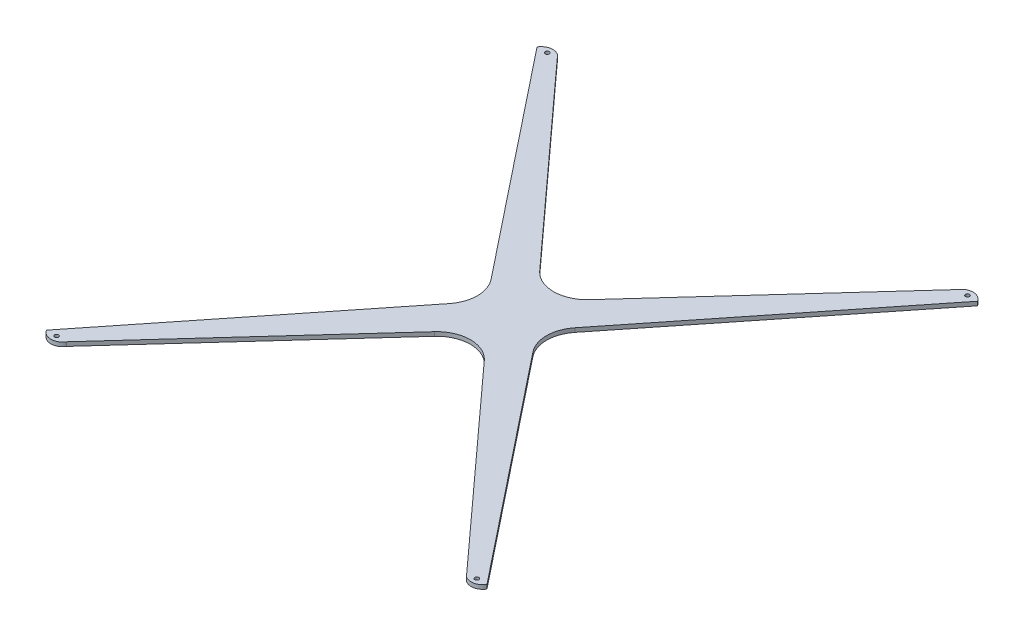
ISO-10303-21;
HEADER;
FILE_DESCRIPTION(('STEP AP214'),'2;1');
FILE_NAME('part.step','',(''),(''),'','','');
FILE_SCHEMA(('AUTOMOTIVE_DESIGN { 1 0 10303 214 1 1 1 1 }'));
ENDSEC;
DATA;
#1=APPLICATION_CONTEXT('core data for automotive mechanical design processes');
#2=APPLICATION_PROTOCOL_DEFINITION('international standard','automotive_design',2000,#1);
#3=PRODUCT_CONTEXT('',#1,'mechanical');
#4=PRODUCT('Part','Part','',(#3));
#5=PRODUCT_RELATED_PRODUCT_CATEGORY('part','',(#4));
#6=PRODUCT_DEFINITION_FORMATION('','',#4);
#7=PRODUCT_DEFINITION_CONTEXT('part definition',#1,'design');
#8=PRODUCT_DEFINITION('design','',#6,#7);
#9=PRODUCT_DEFINITION_SHAPE('','',#8);
#10=(LENGTH_UNIT() NAMED_UNIT(*) SI_UNIT(.MILLI.,.METRE.));
#11=(NAMED_UNIT(*) PLANE_ANGLE_UNIT() SI_UNIT($,.RADIAN.));
#12=(NAMED_UNIT(*) SI_UNIT($,.STERADIAN.) SOLID_ANGLE_UNIT());
#13=UNCERTAINTY_MEASURE_WITH_UNIT(LENGTH_MEASURE(1.E-05),#10,'distance_accuracy_value','');
#14=(GEOMETRIC_REPRESENTATION_CONTEXT(3) GLOBAL_UNCERTAINTY_ASSIGNED_CONTEXT((#13)) GLOBAL_UNIT_ASSIGNED_CONTEXT((#10,
#11,#12)) REPRESENTATION_CONTEXT('',''));
#15=CARTESIAN_POINT('',(0.,0.,0.));
#16=DIRECTION('',(0.,0.,1.));
#17=DIRECTION('',(1.,0.,0.));
#18=AXIS2_PLACEMENT_3D('',#15,#16,#17);
#19=CARTESIAN_POINT('',(0.,12.,-1441.02941176471));
#20=DIRECTION('',(0.,-1.,0.));
#21=DIRECTION('',(0.,0.,-1.));
#22=AXIS2_PLACEMENT_3D('',#19,#20,#21);
#23=PLANE('',#22);
#24=CARTESIAN_POINT('',(0.,12.,-1441.02941176471));
#25=DIRECTION('',(0.,1.,0.));
#26=DIRECTION('',(0.,0.,-1.));
#27=AXIS2_PLACEMENT_3D('',#24,#25,#26);
#28=CIRCLE('',#27,34.9705882352942);
#29=CARTESIAN_POINT('',(30.,12.,-1459.));
#30=VERTEX_POINT('',#29);
#31=CARTESIAN_POINT('',(-30.,12.,-1459.));
#32=VERTEX_POINT('',#31);
#33=EDGE_CURVE('E157',#30,#32,#28,.T.);
#34=ORIENTED_EDGE('',*,*,#33,.T.);
#35=DIRECTION('',(0.622336851804277,0.,0.78274954032969));
#36=VECTOR('',#35,1.);
#37=CARTESIAN_POINT('',(550.,12.,-729.5));
#38=LINE('',#37,#36);
#39=CARTESIAN_POINT('',(500.520168053944,12.,-791.733685180428));
#40=VERTEX_POINT('',#39);
#41=EDGE_CURVE('E145',#32,#40,#38,.T.);
#42=ORIENTED_EDGE('',*,*,#41,.T.);
#43=CARTESIAN_POINT('',(422.245214020975,12.,-729.5));
#44=DIRECTION('',(0.,-1.,0.));
#45=DIRECTION('',(0.,0.,-1.));
#46=AXIS2_PLACEMENT_3D('',#43,#44,#45);
#47=CIRCLE('',#46,100.);
#48=CARTESIAN_POINT('',(500.520168053944,12.,-667.266314819572));
#49=VERTEX_POINT('',#48);
#50=EDGE_CURVE('E198',#40,#49,#47,.T.);
#51=ORIENTED_EDGE('',*,*,#50,.T.);
#52=DIRECTION('',(-0.622336851804277,0.,0.78274954032969));
#53=VECTOR('',#52,1.);
#54=CARTESIAN_POINT('',(550.,12.,-729.5));
#55=LINE('',#54,#53);
#56=CARTESIAN_POINT('',(-30.,12.,0.));
#57=VERTEX_POINT('',#56);
#58=EDGE_CURVE('E156',#49,#57,#55,.T.);
#59=ORIENTED_EDGE('',*,*,#58,.T.);
#60=CARTESIAN_POINT('',(0.,12.,-17.9705882352943));
#61=DIRECTION('',(0.,1.,0.));
#62=DIRECTION('',(0.,0.,1.));
#63=AXIS2_PLACEMENT_3D('',#60,#61,#62);
#64=CIRCLE('',#63,34.9705882352942);
#65=CARTESIAN_POINT('',(30.,12.,0.));
#66=VERTEX_POINT('',#65);
#67=EDGE_CURVE('E291',#57,#66,#64,.T.);
#68=ORIENTED_EDGE('',*,*,#67,.T.);
#69=DIRECTION('',(0.672672793996312,0.,-0.739940073395944));
#70=VECTOR('',#69,1.);
#71=CARTESIAN_POINT('',(30.,12.,0.));
#72=LINE('',#71,#70);
#73=CARTESIAN_POINT('',(551.005992660406,12.,-573.106591926446));
#74=VERTEX_POINT('',#73);
#75=EDGE_CURVE('E265',#66,#74,#72,.T.);
#76=ORIENTED_EDGE('',*,*,#75,.T.);
#77=CARTESIAN_POINT('',(625.,12.,-505.839312526815));
#78=DIRECTION('',(0.,-1.,0.));
#79=DIRECTION('',(0.,0.,-1.));
#80=AXIS2_PLACEMENT_3D('',#77,#78,#79);
#81=CIRCLE('',#80,100.);
#82=CARTESIAN_POINT('',(698.994007339594,12.,-573.106591926446));
#83=VERTEX_POINT('',#82);
#84=EDGE_CURVE('E11',#74,#83,#81,.T.);
#85=ORIENTED_EDGE('',*,*,#84,.T.);
#86=DIRECTION('',(0.672672793996312,0.,0.739940073395944));
#87=VECTOR('',#86,1.);
#88=CARTESIAN_POINT('',(625.,12.,-654.5));
#89=LINE('',#88,#87);
#90=CARTESIAN_POINT('',(1220.,12.,0.));
#91=VERTEX_POINT('',#90);
#92=EDGE_CURVE('E288',#83,#91,#89,.T.);
#93=ORIENTED_EDGE('',*,*,#92,.T.);
#94=CARTESIAN_POINT('',(1250.,12.,-17.9705882352938));
#95=DIRECTION('',(0.,1.,0.));
#96=DIRECTION('',(0.,0.,-1.));
#97=AXIS2_PLACEMENT_3D('',#94,#95,#96);
#98=CIRCLE('',#97,34.970588235294);
#99=CARTESIAN_POINT('',(1280.,12.,-4.57966997657877E-13));
#100=VERTEX_POINT('',#99);
#101=EDGE_CURVE('E286',#91,#100,#98,.T.);
#102=ORIENTED_EDGE('',*,*,#101,.T.);
#103=DIRECTION('',(-0.622336851804277,0.,-0.78274954032969));
#104=VECTOR('',#103,1.);
#105=CARTESIAN_POINT('',(1280.,12.,0.));
#106=LINE('',#105,#104);
#107=CARTESIAN_POINT('',(749.479831946056,12.,-667.266314819573));
#108=VERTEX_POINT('',#107);
#109=EDGE_CURVE('E213',#100,#108,#106,.T.);
#110=ORIENTED_EDGE('',*,*,#109,.T.);
#111=CARTESIAN_POINT('',(827.754785979025,12.,-729.5));
#112=DIRECTION('',(0.,-1.,0.));
#113=DIRECTION('',(0.,0.,-1.));
#114=AXIS2_PLACEMENT_3D('',#111,#112,#113);
#115=CIRCLE('',#114,100.);
#116=CARTESIAN_POINT('',(749.479831946056,12.,-791.733685180428));
#117=VERTEX_POINT('',#116);
#118=EDGE_CURVE('E206',#108,#117,#115,.T.);
#119=ORIENTED_EDGE('',*,*,#118,.T.);
#120=DIRECTION('',(0.622336851804277,0.,-0.78274954032969));
#121=VECTOR('',#120,1.);
#122=CARTESIAN_POINT('',(700.,12.,-729.5));
#123=LINE('',#122,#121);
#124=CARTESIAN_POINT('',(1280.,12.,-1459.));
#125=VERTEX_POINT('',#124);
#126=EDGE_CURVE('E210',#117,#125,#123,.T.);
#127=ORIENTED_EDGE('',*,*,#126,.T.);
#128=CARTESIAN_POINT('',(1250.,12.,-1441.02941176471));
#129=DIRECTION('',(0.,1.,0.));
#130=DIRECTION('',(0.,0.,1.));
#131=AXIS2_PLACEMENT_3D('',#128,#129,#130);
#132=CIRCLE('',#131,34.9705882352942);
#133=CARTESIAN_POINT('',(1220.,12.,-1459.));
#134=VERTEX_POINT('',#133);
#135=EDGE_CURVE('E223',#125,#134,#132,.T.);
#136=ORIENTED_EDGE('',*,*,#135,.T.);
#137=DIRECTION('',(-0.672672793996312,0.,0.739940073395944));
#138=VECTOR('',#137,1.);
#139=CARTESIAN_POINT('',(625.,12.,-804.5));
#140=LINE('',#139,#138);
#141=CARTESIAN_POINT('',(698.994007339594,12.,-885.893408073554));
#142=VERTEX_POINT('',#141);
#143=EDGE_CURVE('E281',#134,#142,#140,.T.);
#144=ORIENTED_EDGE('',*,*,#143,.T.);
#145=CARTESIAN_POINT('',(625.,12.,-953.160687473185));
#146=DIRECTION('',(0.,-1.,0.));
#147=DIRECTION('',(0.,0.,-1.));
#148=AXIS2_PLACEMENT_3D('',#145,#146,#147);
#149=CIRCLE('',#148,100.);
#150=CARTESIAN_POINT('',(551.005992660406,12.,-885.893408073554));
#151=VERTEX_POINT('',#150);
#152=EDGE_CURVE('E202',#142,#151,#149,.T.);
#153=ORIENTED_EDGE('',*,*,#152,.T.);
#154=DIRECTION('',(-0.672672793996312,0.,-0.739940073395944));
#155=VECTOR('',#154,1.);
#156=CARTESIAN_POINT('',(30.,12.,-1459.));
#157=LINE('',#156,#155);
#158=EDGE_CURVE('E162',#151,#30,#157,.T.);
#159=ORIENTED_EDGE('',*,*,#158,.T.);
#160=EDGE_LOOP('',(#34,#42,#51,#59,#68,#76,#85,#93,#102,#110,#119,#127,#136,#144,#153,#159));
#161=FACE_BOUND('',#160,.T.);
#162=CARTESIAN_POINT('',(1250.,12.,-1459.));
#163=DIRECTION('',(0.,1.,0.));
#164=DIRECTION('',(0.,0.,1.));
#165=AXIS2_PLACEMENT_3D('',#162,#163,#164);
#166=CIRCLE('',#165,6.0000000000001);
#167=CARTESIAN_POINT('',(1250.,12.,-1453.));
#168=VERTEX_POINT('',#167);
#169=EDGE_CURVE('E279',#168,#168,#166,.T.);
#170=ORIENTED_EDGE('',*,*,#169,.F.);
#171=EDGE_LOOP('',(#170));
#172=FACE_BOUND('',#171,.T.);
#173=CARTESIAN_POINT('',(0.,12.,-1459.));
#174=DIRECTION('',(0.,1.,0.));
#175=DIRECTION('',(0.,0.,1.));
#176=AXIS2_PLACEMENT_3D('',#173,#174,#175);
#177=CIRCLE('',#176,6.00000000000001);
#178=CARTESIAN_POINT('',(0.,12.,-1453.));
#179=VERTEX_POINT('',#178);
#180=EDGE_CURVE('E297',#179,#179,#177,.T.);
#181=ORIENTED_EDGE('',*,*,#180,.F.);
#182=EDGE_LOOP('',(#181));
#183=FACE_BOUND('',#182,.T.);
#184=CARTESIAN_POINT('',(1250.,12.,0.));
#185=DIRECTION('',(0.,1.,0.));
#186=DIRECTION('',(0.,0.,1.));
#187=AXIS2_PLACEMENT_3D('',#184,#185,#186);
#188=CIRCLE('',#187,6.0000000000001);
#189=CARTESIAN_POINT('',(1250.,12.,6.0000000000001));
#190=VERTEX_POINT('',#189);
#191=EDGE_CURVE('E303',#190,#190,#188,.T.);
#192=ORIENTED_EDGE('',*,*,#191,.F.);
#193=EDGE_LOOP('',(#192));
#194=FACE_BOUND('',#193,.T.);
#195=CARTESIAN_POINT('',(0.,12.,0.));
#196=DIRECTION('',(0.,1.,0.));
#197=DIRECTION('',(0.,0.,1.));
#198=AXIS2_PLACEMENT_3D('',#195,#196,#197);
#199=CIRCLE('',#198,6.);
#200=CARTESIAN_POINT('',(0.,12.,6.));
#201=VERTEX_POINT('',#200);
#202=EDGE_CURVE('E309',#201,#201,#199,.T.);
#203=ORIENTED_EDGE('',*,*,#202,.F.);
#204=EDGE_LOOP('',(#203));
#205=FACE_BOUND('',#204,.T.);
#206=ADVANCED_FACE('F32',(#161,#172,#183,#194,#205),#23,.F.);
#207=CARTESIAN_POINT('',(0.,0.,-1441.02941176471));
#208=DIRECTION('',(0.,-1.,0.));
#209=DIRECTION('',(0.,0.,-1.));
#210=AXIS2_PLACEMENT_3D('',#207,#208,#209);
#211=PLANE('',#210);
#212=CARTESIAN_POINT('',(1250.,0.,0.));
#213=DIRECTION('',(0.,1.,0.));
#214=DIRECTION('',(0.,0.,1.));
#215=AXIS2_PLACEMENT_3D('',#212,#213,#214);
#216=CIRCLE('',#215,6.0000000000001);
#217=CARTESIAN_POINT('',(1250.,0.,6.0000000000001));
#218=VERTEX_POINT('',#217);
#219=EDGE_CURVE('E306',#218,#218,#216,.T.);
#220=ORIENTED_EDGE('',*,*,#219,.T.);
#221=EDGE_LOOP('',(#220));
#222=FACE_BOUND('',#221,.T.);
#223=CARTESIAN_POINT('',(1250.,0.,-1459.));
#224=DIRECTION('',(0.,1.,0.));
#225=DIRECTION('',(0.,0.,1.));
#226=AXIS2_PLACEMENT_3D('',#223,#224,#225);
#227=CIRCLE('',#226,6.0000000000001);
#228=CARTESIAN_POINT('',(1250.,0.,-1453.));
#229=VERTEX_POINT('',#228);
#230=EDGE_CURVE('E294',#229,#229,#227,.T.);
#231=ORIENTED_EDGE('',*,*,#230,.T.);
#232=EDGE_LOOP('',(#231));
#233=FACE_BOUND('',#232,.T.);
#234=CARTESIAN_POINT('',(0.,0.,-1441.02941176471));
#235=DIRECTION('',(0.,1.,0.));
#236=DIRECTION('',(0.,0.,-1.));
#237=AXIS2_PLACEMENT_3D('',#234,#235,#236);
#238=CIRCLE('',#237,34.9705882352942);
#239=CARTESIAN_POINT('',(30.,0.,-1459.));
#240=VERTEX_POINT('',#239);
#241=CARTESIAN_POINT('',(-30.,0.,-1459.));
#242=VERTEX_POINT('',#241);
#243=EDGE_CURVE('E170',#240,#242,#238,.T.);
#244=ORIENTED_EDGE('',*,*,#243,.F.);
#245=DIRECTION('',(-0.672672793996312,0.,-0.739940073395944));
#246=VECTOR('',#245,1.);
#247=CARTESIAN_POINT('',(30.,0.,-1459.));
#248=LINE('',#247,#246);
#249=CARTESIAN_POINT('',(551.005992660406,0.,-885.893408073554));
#250=VERTEX_POINT('',#249);
#251=EDGE_CURVE('E166',#250,#240,#248,.T.);
#252=ORIENTED_EDGE('',*,*,#251,.F.);
#253=CARTESIAN_POINT('',(625.,0.,-953.160687473185));
#254=DIRECTION('',(0.,-1.,0.));
#255=DIRECTION('',(0.,0.,-1.));
#256=AXIS2_PLACEMENT_3D('',#253,#254,#255);
#257=CIRCLE('',#256,100.);
#258=CARTESIAN_POINT('',(698.994007339594,0.,-885.893408073554));
#259=VERTEX_POINT('',#258);
#260=EDGE_CURVE('E200',#250,#259,#257,.F.);
#261=ORIENTED_EDGE('',*,*,#260,.T.);
#262=DIRECTION('',(-0.672672793996312,0.,0.739940073395944));
#263=VECTOR('',#262,1.);
#264=CARTESIAN_POINT('',(625.,0.,-804.5));
#265=LINE('',#264,#263);
#266=CARTESIAN_POINT('',(1220.,0.,-1459.));
#267=VERTEX_POINT('',#266);
#268=EDGE_CURVE('E248',#267,#259,#265,.T.);
#269=ORIENTED_EDGE('',*,*,#268,.F.);
#270=CARTESIAN_POINT('',(1250.,0.,-1441.02941176471));
#271=DIRECTION('',(0.,1.,0.));
#272=DIRECTION('',(0.,0.,1.));
#273=AXIS2_PLACEMENT_3D('',#270,#271,#272);
#274=CIRCLE('',#273,34.9705882352942);
#275=CARTESIAN_POINT('',(1280.,0.,-1459.));
#276=VERTEX_POINT('',#275);
#277=EDGE_CURVE('E241',#276,#267,#274,.T.);
#278=ORIENTED_EDGE('',*,*,#277,.F.);
#279=DIRECTION('',(0.622336851804277,0.,-0.78274954032969));
#280=VECTOR('',#279,1.);
#281=CARTESIAN_POINT('',(700.,0.,-729.5));
#282=LINE('',#281,#280);
#283=CARTESIAN_POINT('',(749.479831946056,0.,-791.733685180428));
#284=VERTEX_POINT('',#283);
#285=EDGE_CURVE('E233',#284,#276,#282,.T.);
#286=ORIENTED_EDGE('',*,*,#285,.F.);
#287=CARTESIAN_POINT('',(827.754785979025,0.,-729.5));
#288=DIRECTION('',(0.,-1.,0.));
#289=DIRECTION('',(0.,0.,-1.));
#290=AXIS2_PLACEMENT_3D('',#287,#288,#289);
#291=CIRCLE('',#290,100.);
#292=CARTESIAN_POINT('',(749.479831946056,0.,-667.266314819573));
#293=VERTEX_POINT('',#292);
#294=EDGE_CURVE('E204',#284,#293,#291,.F.);
#295=ORIENTED_EDGE('',*,*,#294,.T.);
#296=DIRECTION('',(-0.622336851804277,0.,-0.78274954032969));
#297=VECTOR('',#296,1.);
#298=CARTESIAN_POINT('',(1280.,0.,0.));
#299=LINE('',#298,#297);
#300=CARTESIAN_POINT('',(1280.,0.,-4.57966997657877E-13));
#301=VERTEX_POINT('',#300);
#302=EDGE_CURVE('E231',#301,#293,#299,.T.);
#303=ORIENTED_EDGE('',*,*,#302,.F.);
#304=CARTESIAN_POINT('',(1250.,0.,-17.9705882352938));
#305=DIRECTION('',(0.,1.,0.));
#306=DIRECTION('',(0.,0.,-1.));
#307=AXIS2_PLACEMENT_3D('',#304,#305,#306);
#308=CIRCLE('',#307,34.970588235294);
#309=CARTESIAN_POINT('',(1220.,0.,0.));
#310=VERTEX_POINT('',#309);
#311=EDGE_CURVE('E239',#310,#301,#308,.T.);
#312=ORIENTED_EDGE('',*,*,#311,.F.);
#313=DIRECTION('',(0.672672793996312,0.,0.739940073395944));
#314=VECTOR('',#313,1.);
#315=CARTESIAN_POINT('',(625.,0.,-654.5));
#316=LINE('',#315,#314);
#317=CARTESIAN_POINT('',(698.994007339594,0.,-573.106591926446));
#318=VERTEX_POINT('',#317);
#319=EDGE_CURVE('E243',#318,#310,#316,.T.);
#320=ORIENTED_EDGE('',*,*,#319,.F.);
#321=CARTESIAN_POINT('',(625.,0.,-505.839312526815));
#322=DIRECTION('',(0.,-1.,0.));
#323=DIRECTION('',(0.,0.,-1.));
#324=AXIS2_PLACEMENT_3D('',#321,#322,#323);
#325=CIRCLE('',#324,100.);
#326=CARTESIAN_POINT('',(551.005992660406,0.,-573.106591926446));
#327=VERTEX_POINT('',#326);
#328=EDGE_CURVE('E40',#318,#327,#325,.F.);
#329=ORIENTED_EDGE('',*,*,#328,.T.);
#330=DIRECTION('',(0.672672793996312,0.,-0.739940073395944));
#331=VECTOR('',#330,1.);
#332=CARTESIAN_POINT('',(30.,0.,0.));
#333=LINE('',#332,#331);
#334=CARTESIAN_POINT('',(30.,0.,0.));
#335=VERTEX_POINT('',#334);
#336=EDGE_CURVE('E264',#335,#327,#333,.T.);
#337=ORIENTED_EDGE('',*,*,#336,.F.);
#338=CARTESIAN_POINT('',(0.,0.,-17.9705882352943));
#339=DIRECTION('',(0.,1.,0.));
#340=DIRECTION('',(0.,0.,1.));
#341=AXIS2_PLACEMENT_3D('',#338,#339,#340);
#342=CIRCLE('',#341,34.9705882352942);
#343=CARTESIAN_POINT('',(-30.,0.,0.));
#344=VERTEX_POINT('',#343);
#345=EDGE_CURVE('E270',#344,#335,#342,.T.);
#346=ORIENTED_EDGE('',*,*,#345,.F.);
#347=DIRECTION('',(-0.622336851804277,0.,0.78274954032969));
#348=VECTOR('',#347,1.);
#349=CARTESIAN_POINT('',(550.,0.,-729.5));
#350=LINE('',#349,#348);
#351=CARTESIAN_POINT('',(500.520168053944,0.,-667.266314819572));
#352=VERTEX_POINT('',#351);
#353=EDGE_CURVE('E272',#352,#344,#350,.T.);
#354=ORIENTED_EDGE('',*,*,#353,.F.);
#355=CARTESIAN_POINT('',(422.245214020975,0.,-729.5));
#356=DIRECTION('',(0.,-1.,0.));
#357=DIRECTION('',(0.,0.,-1.));
#358=AXIS2_PLACEMENT_3D('',#355,#356,#357);
#359=CIRCLE('',#358,100.);
#360=CARTESIAN_POINT('',(500.520168053944,0.,-791.733685180428));
#361=VERTEX_POINT('',#360);
#362=EDGE_CURVE('E196',#352,#361,#359,.F.);
#363=ORIENTED_EDGE('',*,*,#362,.T.);
#364=DIRECTION('',(0.622336851804277,0.,0.78274954032969));
#365=VECTOR('',#364,1.);
#366=CARTESIAN_POINT('',(550.,0.,-729.5));
#367=LINE('',#366,#365);
#368=EDGE_CURVE('E276',#242,#361,#367,.T.);
#369=ORIENTED_EDGE('',*,*,#368,.F.);
#370=EDGE_LOOP('',(#244,#252,#261,#269,#278,#286,#295,#303,#312,#320,#329,#337,#346,#354,#363,#369));
#371=FACE_BOUND('',#370,.T.);
#372=CARTESIAN_POINT('',(0.,0.,-1459.));
#373=DIRECTION('',(0.,1.,0.));
#374=DIRECTION('',(0.,0.,1.));
#375=AXIS2_PLACEMENT_3D('',#372,#373,#374);
#376=CIRCLE('',#375,6.00000000000001);
#377=CARTESIAN_POINT('',(0.,0.,-1453.));
#378=VERTEX_POINT('',#377);
#379=EDGE_CURVE('E300',#378,#378,#376,.T.);
#380=ORIENTED_EDGE('',*,*,#379,.T.);
#381=EDGE_LOOP('',(#380));
#382=FACE_BOUND('',#381,.T.);
#383=CARTESIAN_POINT('',(0.,0.,0.));
#384=DIRECTION('',(0.,1.,0.));
#385=DIRECTION('',(0.,0.,1.));
#386=AXIS2_PLACEMENT_3D('',#383,#384,#385);
#387=CIRCLE('',#386,6.);
#388=CARTESIAN_POINT('',(0.,0.,6.));
#389=VERTEX_POINT('',#388);
#390=EDGE_CURVE('E312',#389,#389,#387,.T.);
#391=ORIENTED_EDGE('',*,*,#390,.T.);
#392=EDGE_LOOP('',(#391));
#393=FACE_BOUND('',#392,.T.);
#394=ADVANCED_FACE('F228',(#222,#233,#371,#382,#393),#211,.T.);
#395=CARTESIAN_POINT('',(0.,12.,-1441.02941176471));
#396=DIRECTION('',(0.,-1.,0.));
#397=DIRECTION('',(0.,0.,-1.));
#398=AXIS2_PLACEMENT_3D('',#395,#396,#397);
#399=CYLINDRICAL_SURFACE('',#398,34.9705882352942);
#400=ORIENTED_EDGE('',*,*,#243,.T.);
#401=DIRECTION('',(0.,-1.,0.));
#402=VECTOR('',#401,1.);
#403=CARTESIAN_POINT('',(-30.,12.,-1459.));
#404=LINE('',#403,#402);
#405=EDGE_CURVE('E150',#32,#242,#404,.T.);
#406=ORIENTED_EDGE('',*,*,#405,.F.);
#407=ORIENTED_EDGE('',*,*,#33,.F.);
#408=DIRECTION('',(0.,-1.,0.));
#409=VECTOR('',#408,1.);
#410=CARTESIAN_POINT('',(30.,12.,-1459.));
#411=LINE('',#410,#409);
#412=EDGE_CURVE('E252',#30,#240,#411,.T.);
#413=ORIENTED_EDGE('',*,*,#412,.T.);
#414=EDGE_LOOP('',(#400,#406,#407,#413));
#415=FACE_BOUND('',#414,.T.);
#416=ADVANCED_FACE('F168',(#415),#399,.T.);
#417=CARTESIAN_POINT('',(550.,12.,-729.5));
#418=DIRECTION('',(0.78274954032969,0.,-0.622336851804277));
#419=DIRECTION('',(-0.622336851804277,0.,-0.78274954032969));
#420=AXIS2_PLACEMENT_3D('',#417,#418,#419);
#421=PLANE('',#420);
#422=ORIENTED_EDGE('',*,*,#368,.T.);
#423=DIRECTION('',(0.,-1.,0.));
#424=VECTOR('',#423,1.);
#425=CARTESIAN_POINT('',(500.520168053944,12.,-791.733685180428));
#426=LINE('',#425,#424);
#427=EDGE_CURVE('E153',#361,#40,#426,.F.);
#428=ORIENTED_EDGE('',*,*,#427,.T.);
#429=ORIENTED_EDGE('',*,*,#41,.F.);
#430=ORIENTED_EDGE('',*,*,#405,.T.);
#431=EDGE_LOOP('',(#422,#428,#429,#430));
#432=FACE_BOUND('',#431,.T.);
#433=ADVANCED_FACE('F148',(#432),#421,.F.);
#434=CARTESIAN_POINT('',(550.,12.,-729.5));
#435=DIRECTION('',(0.78274954032969,0.,0.622336851804277));
#436=DIRECTION('',(0.622336851804277,0.,-0.78274954032969));
#437=AXIS2_PLACEMENT_3D('',#434,#435,#436);
#438=PLANE('',#437);
#439=ORIENTED_EDGE('',*,*,#58,.F.);
#440=DIRECTION('',(0.,-1.,0.));
#441=VECTOR('',#440,1.);
#442=CARTESIAN_POINT('',(500.520168053944,0.,-667.266314819572));
#443=LINE('',#442,#441);
#444=EDGE_CURVE('E171',#49,#352,#443,.T.);
#445=ORIENTED_EDGE('',*,*,#444,.T.);
#446=ORIENTED_EDGE('',*,*,#353,.T.);
#447=DIRECTION('',(0.,-1.,0.));
#448=VECTOR('',#447,1.);
#449=CARTESIAN_POINT('',(-30.,12.,0.));
#450=LINE('',#449,#448);
#451=EDGE_CURVE('E172',#57,#344,#450,.T.);
#452=ORIENTED_EDGE('',*,*,#451,.F.);
#453=EDGE_LOOP('',(#439,#445,#446,#452));
#454=FACE_BOUND('',#453,.T.);
#455=ADVANCED_FACE('F361',(#454),#438,.F.);
#456=CARTESIAN_POINT('',(0.,12.,-17.9705882352943));
#457=DIRECTION('',(0.,-1.,0.));
#458=DIRECTION('',(0.,0.,-1.));
#459=AXIS2_PLACEMENT_3D('',#456,#457,#458);
#460=CYLINDRICAL_SURFACE('',#459,34.9705882352942);
#461=ORIENTED_EDGE('',*,*,#345,.T.);
#462=DIRECTION('',(0.,-1.,0.));
#463=VECTOR('',#462,1.);
#464=CARTESIAN_POINT('',(30.,12.,0.));
#465=LINE('',#464,#463);
#466=EDGE_CURVE('E177',#66,#335,#465,.T.);
#467=ORIENTED_EDGE('',*,*,#466,.F.);
#468=ORIENTED_EDGE('',*,*,#67,.F.);
#469=ORIENTED_EDGE('',*,*,#451,.T.);
#470=EDGE_LOOP('',(#461,#467,#468,#469));
#471=FACE_BOUND('',#470,.T.);
#472=ADVANCED_FACE('F358',(#471),#460,.T.);
#473=CARTESIAN_POINT('',(30.,12.,0.));
#474=DIRECTION('',(-0.739940073395944,0.,-0.672672793996312));
#475=DIRECTION('',(-0.672672793996312,0.,0.739940073395944));
#476=AXIS2_PLACEMENT_3D('',#473,#474,#475);
#477=PLANE('',#476);
#478=ORIENTED_EDGE('',*,*,#336,.T.);
#479=DIRECTION('',(0.,-1.,0.));
#480=VECTOR('',#479,1.);
#481=CARTESIAN_POINT('',(551.005992660406,12.,-573.106591926446));
#482=LINE('',#481,#480);
#483=EDGE_CURVE('E47',#327,#74,#482,.F.);
#484=ORIENTED_EDGE('',*,*,#483,.T.);
#485=ORIENTED_EDGE('',*,*,#75,.F.);
#486=ORIENTED_EDGE('',*,*,#466,.T.);
#487=EDGE_LOOP('',(#478,#484,#485,#486));
#488=FACE_BOUND('',#487,.T.);
#489=ADVANCED_FACE('F263',(#488),#477,.F.);
#490=CARTESIAN_POINT('',(625.,12.,-654.5));
#491=DIRECTION('',(0.739940073395944,0.,-0.672672793996312));
#492=DIRECTION('',(-0.672672793996312,0.,-0.739940073395944));
#493=AXIS2_PLACEMENT_3D('',#490,#491,#492);
#494=PLANE('',#493);
#495=ORIENTED_EDGE('',*,*,#92,.F.);
#496=DIRECTION('',(0.,-1.,0.));
#497=VECTOR('',#496,1.);
#498=CARTESIAN_POINT('',(698.994007339594,0.,-573.106591926446));
#499=LINE('',#498,#497);
#500=EDGE_CURVE('E192',#83,#318,#499,.T.);
#501=ORIENTED_EDGE('',*,*,#500,.T.);
#502=ORIENTED_EDGE('',*,*,#319,.T.);
#503=DIRECTION('',(0.,-1.,0.));
#504=VECTOR('',#503,1.);
#505=CARTESIAN_POINT('',(1220.,12.,0.));
#506=LINE('',#505,#504);
#507=EDGE_CURVE('E259',#91,#310,#506,.T.);
#508=ORIENTED_EDGE('',*,*,#507,.F.);
#509=EDGE_LOOP('',(#495,#501,#502,#508));
#510=FACE_BOUND('',#509,.T.);
#511=ADVANCED_FACE('F351',(#510),#494,.F.);
#512=CARTESIAN_POINT('',(1250.,12.,-17.9705882352938));
#513=DIRECTION('',(0.,-1.,0.));
#514=DIRECTION('',(0.,0.,-1.));
#515=AXIS2_PLACEMENT_3D('',#512,#513,#514);
#516=CYLINDRICAL_SURFACE('',#515,34.970588235294);
#517=ORIENTED_EDGE('',*,*,#311,.T.);
#518=DIRECTION('',(0.,-1.,0.));
#519=VECTOR('',#518,1.);
#520=CARTESIAN_POINT('',(1280.,12.,-4.57966997657877E-13));
#521=LINE('',#520,#519);
#522=EDGE_CURVE('E238',#100,#301,#521,.T.);
#523=ORIENTED_EDGE('',*,*,#522,.F.);
#524=ORIENTED_EDGE('',*,*,#101,.F.);
#525=ORIENTED_EDGE('',*,*,#507,.T.);
#526=EDGE_LOOP('',(#517,#523,#524,#525));
#527=FACE_BOUND('',#526,.T.);
#528=ADVANCED_FACE('F348',(#527),#516,.T.);
#529=CARTESIAN_POINT('',(1280.,12.,0.));
#530=DIRECTION('',(-0.78274954032969,0.,0.622336851804277));
#531=DIRECTION('',(0.622336851804277,0.,0.78274954032969));
#532=AXIS2_PLACEMENT_3D('',#529,#530,#531);
#533=PLANE('',#532);
#534=ORIENTED_EDGE('',*,*,#302,.T.);
#535=DIRECTION('',(0.,-1.,0.));
#536=VECTOR('',#535,1.);
#537=CARTESIAN_POINT('',(749.479831946056,12.,-667.266314819572));
#538=LINE('',#537,#536);
#539=EDGE_CURVE('E190',#293,#108,#538,.F.);
#540=ORIENTED_EDGE('',*,*,#539,.T.);
#541=ORIENTED_EDGE('',*,*,#109,.F.);
#542=ORIENTED_EDGE('',*,*,#522,.T.);
#543=EDGE_LOOP('',(#534,#540,#541,#542));
#544=FACE_BOUND('',#543,.T.);
#545=ADVANCED_FACE('F236',(#544),#533,.F.);
#546=CARTESIAN_POINT('',(700.,12.,-729.5));
#547=DIRECTION('',(-0.78274954032969,0.,-0.622336851804277));
#548=DIRECTION('',(-0.622336851804277,0.,0.78274954032969));
#549=AXIS2_PLACEMENT_3D('',#546,#547,#548);
#550=PLANE('',#549);
#551=ORIENTED_EDGE('',*,*,#126,.F.);
#552=DIRECTION('',(0.,-1.,0.));
#553=VECTOR('',#552,1.);
#554=CARTESIAN_POINT('',(749.479831946056,0.,-791.733685180428));
#555=LINE('',#554,#553);
#556=EDGE_CURVE('E187',#117,#284,#555,.T.);
#557=ORIENTED_EDGE('',*,*,#556,.T.);
#558=ORIENTED_EDGE('',*,*,#285,.T.);
#559=DIRECTION('',(0.,-1.,0.));
#560=VECTOR('',#559,1.);
#561=CARTESIAN_POINT('',(1280.,12.,-1459.));
#562=LINE('',#561,#560);
#563=EDGE_CURVE('E221',#125,#276,#562,.T.);
#564=ORIENTED_EDGE('',*,*,#563,.F.);
#565=EDGE_LOOP('',(#551,#557,#558,#564));
#566=FACE_BOUND('',#565,.T.);
#567=ADVANCED_FACE('F218',(#566),#550,.F.);
#568=CARTESIAN_POINT('',(1250.,12.,-1441.02941176471));
#569=DIRECTION('',(0.,-1.,0.));
#570=DIRECTION('',(0.,0.,-1.));
#571=AXIS2_PLACEMENT_3D('',#568,#569,#570);
#572=CYLINDRICAL_SURFACE('',#571,34.9705882352942);
#573=ORIENTED_EDGE('',*,*,#277,.T.);
#574=DIRECTION('',(0.,-1.,0.));
#575=VECTOR('',#574,1.);
#576=CARTESIAN_POINT('',(1220.,12.,-1459.));
#577=LINE('',#576,#575);
#578=EDGE_CURVE('E254',#134,#267,#577,.T.);
#579=ORIENTED_EDGE('',*,*,#578,.F.);
#580=ORIENTED_EDGE('',*,*,#135,.F.);
#581=ORIENTED_EDGE('',*,*,#563,.T.);
#582=EDGE_LOOP('',(#573,#579,#580,#581));
#583=FACE_BOUND('',#582,.T.);
#584=ADVANCED_FACE('F339',(#583),#572,.T.);
#585=CARTESIAN_POINT('',(625.,12.,-804.5));
#586=DIRECTION('',(0.739940073395944,0.,0.672672793996312));
#587=DIRECTION('',(0.672672793996312,0.,-0.739940073395944));
#588=AXIS2_PLACEMENT_3D('',#585,#586,#587);
#589=PLANE('',#588);
#590=ORIENTED_EDGE('',*,*,#268,.T.);
#591=DIRECTION('',(0.,-1.,0.));
#592=VECTOR('',#591,1.);
#593=CARTESIAN_POINT('',(698.994007339594,12.,-885.893408073554));
#594=LINE('',#593,#592);
#595=EDGE_CURVE('E185',#259,#142,#594,.F.);
#596=ORIENTED_EDGE('',*,*,#595,.T.);
#597=ORIENTED_EDGE('',*,*,#143,.F.);
#598=ORIENTED_EDGE('',*,*,#578,.T.);
#599=EDGE_LOOP('',(#590,#596,#597,#598));
#600=FACE_BOUND('',#599,.T.);
#601=ADVANCED_FACE('F335',(#600),#589,.F.);
#602=CARTESIAN_POINT('',(30.,12.,-1459.));
#603=DIRECTION('',(-0.739940073395944,0.,0.672672793996312));
#604=DIRECTION('',(0.672672793996312,0.,0.739940073395944));
#605=AXIS2_PLACEMENT_3D('',#602,#603,#604);
#606=PLANE('',#605);
#607=ORIENTED_EDGE('',*,*,#158,.F.);
#608=DIRECTION('',(0.,-1.,0.));
#609=VECTOR('',#608,1.);
#610=CARTESIAN_POINT('',(551.005992660406,0.,-885.893408073554));
#611=LINE('',#610,#609);
#612=EDGE_CURVE('E182',#151,#250,#611,.T.);
#613=ORIENTED_EDGE('',*,*,#612,.T.);
#614=ORIENTED_EDGE('',*,*,#251,.T.);
#615=ORIENTED_EDGE('',*,*,#412,.F.);
#616=EDGE_LOOP('',(#607,#613,#614,#615));
#617=FACE_BOUND('',#616,.T.);
#618=ADVANCED_FACE('F332',(#617),#606,.F.);
#619=CARTESIAN_POINT('',(1250.,12.,-1459.));
#620=DIRECTION('',(0.,-1.,0.));
#621=DIRECTION('',(0.,0.,-1.));
#622=AXIS2_PLACEMENT_3D('',#619,#620,#621);
#623=CYLINDRICAL_SURFACE('',#622,6.0000000000001);
#624=ORIENTED_EDGE('',*,*,#169,.T.);
#625=EDGE_LOOP('',(#624));
#626=FACE_BOUND('',#625,.T.);
#627=ORIENTED_EDGE('',*,*,#230,.F.);
#628=EDGE_LOOP('',(#627));
#629=FACE_BOUND('',#628,.T.);
#630=ADVANCED_FACE('F329',(#626,#629),#623,.F.);
#631=CARTESIAN_POINT('',(0.,12.,-1459.));
#632=DIRECTION('',(0.,-1.,0.));
#633=DIRECTION('',(0.,0.,-1.));
#634=AXIS2_PLACEMENT_3D('',#631,#632,#633);
#635=CYLINDRICAL_SURFACE('',#634,6.00000000000001);
#636=ORIENTED_EDGE('',*,*,#180,.T.);
#637=EDGE_LOOP('',(#636));
#638=FACE_BOUND('',#637,.T.);
#639=ORIENTED_EDGE('',*,*,#379,.F.);
#640=EDGE_LOOP('',(#639));
#641=FACE_BOUND('',#640,.T.);
#642=ADVANCED_FACE('F496',(#638,#641),#635,.F.);
#643=CARTESIAN_POINT('',(1250.,12.,0.));
#644=DIRECTION('',(0.,-1.,0.));
#645=DIRECTION('',(0.,0.,-1.));
#646=AXIS2_PLACEMENT_3D('',#643,#644,#645);
#647=CYLINDRICAL_SURFACE('',#646,6.0000000000001);
#648=ORIENTED_EDGE('',*,*,#191,.T.);
#649=EDGE_LOOP('',(#648));
#650=FACE_BOUND('',#649,.T.);
#651=ORIENTED_EDGE('',*,*,#219,.F.);
#652=EDGE_LOOP('',(#651));
#653=FACE_BOUND('',#652,.T.);
#654=ADVANCED_FACE('F487',(#650,#653),#647,.F.);
#655=CARTESIAN_POINT('',(0.,12.,0.));
#656=DIRECTION('',(0.,-1.,0.));
#657=DIRECTION('',(0.,0.,-1.));
#658=AXIS2_PLACEMENT_3D('',#655,#656,#657);
#659=CYLINDRICAL_SURFACE('',#658,6.);
#660=ORIENTED_EDGE('',*,*,#202,.T.);
#661=EDGE_LOOP('',(#660));
#662=FACE_BOUND('',#661,.T.);
#663=ORIENTED_EDGE('',*,*,#390,.F.);
#664=EDGE_LOOP('',(#663));
#665=FACE_BOUND('',#664,.T.);
#666=ADVANCED_FACE('F318',(#662,#665),#659,.F.);
#667=CARTESIAN_POINT('',(422.245214020975,12.,-729.5));
#668=DIRECTION('',(0.,1.,0.));
#669=DIRECTION('',(0.,0.,1.));
#670=AXIS2_PLACEMENT_3D('',#667,#668,#669);
#671=CYLINDRICAL_SURFACE('',#670,100.);
#672=ORIENTED_EDGE('',*,*,#50,.F.);
#673=ORIENTED_EDGE('',*,*,#427,.F.);
#674=ORIENTED_EDGE('',*,*,#362,.F.);
#675=ORIENTED_EDGE('',*,*,#444,.F.);
#676=EDGE_LOOP('',(#672,#673,#674,#675));
#677=FACE_BOUND('',#676,.T.);
#678=ADVANCED_FACE('F369',(#677),#671,.F.);
#679=CARTESIAN_POINT('',(625.,12.,-953.160687473185));
#680=DIRECTION('',(0.,1.,0.));
#681=DIRECTION('',(0.,0.,1.));
#682=AXIS2_PLACEMENT_3D('',#679,#680,#681);
#683=CYLINDRICAL_SURFACE('',#682,100.);
#684=ORIENTED_EDGE('',*,*,#152,.F.);
#685=ORIENTED_EDGE('',*,*,#595,.F.);
#686=ORIENTED_EDGE('',*,*,#260,.F.);
#687=ORIENTED_EDGE('',*,*,#612,.F.);
#688=EDGE_LOOP('',(#684,#685,#686,#687));
#689=FACE_BOUND('',#688,.T.);
#690=ADVANCED_FACE('F372',(#689),#683,.F.);
#691=CARTESIAN_POINT('',(827.754785979025,12.,-729.5));
#692=DIRECTION('',(0.,1.,0.));
#693=DIRECTION('',(0.,0.,1.));
#694=AXIS2_PLACEMENT_3D('',#691,#692,#693);
#695=CYLINDRICAL_SURFACE('',#694,100.);
#696=ORIENTED_EDGE('',*,*,#118,.F.);
#697=ORIENTED_EDGE('',*,*,#539,.F.);
#698=ORIENTED_EDGE('',*,*,#294,.F.);
#699=ORIENTED_EDGE('',*,*,#556,.F.);
#700=EDGE_LOOP('',(#696,#697,#698,#699));
#701=FACE_BOUND('',#700,.T.);
#702=ADVANCED_FACE('F225',(#701),#695,.F.);
#703=CARTESIAN_POINT('',(625.,12.,-505.839312526815));
#704=DIRECTION('',(0.,1.,0.));
#705=DIRECTION('',(0.,0.,1.));
#706=AXIS2_PLACEMENT_3D('',#703,#704,#705);
#707=CYLINDRICAL_SURFACE('',#706,100.);
#708=ORIENTED_EDGE('',*,*,#84,.F.);
#709=ORIENTED_EDGE('',*,*,#483,.F.);
#710=ORIENTED_EDGE('',*,*,#328,.F.);
#711=ORIENTED_EDGE('',*,*,#500,.F.);
#712=EDGE_LOOP('',(#708,#709,#710,#711));
#713=FACE_BOUND('',#712,.T.);
#714=ADVANCED_FACE('F34',(#713),#707,.F.);
#715=CLOSED_SHELL('',(#206,#394,#416,#433,#455,#472,#489,#511,#528,#545,#567,#584,#601,#618,
#630,#642,#654,#666,#678,#690,#702,#714));
#716=MANIFOLD_SOLID_BREP('B2',#715);
#717=ADVANCED_BREP_SHAPE_REPRESENTATION('',(#18,#716),#14);
#718=SHAPE_DEFINITION_REPRESENTATION(#9,#717);
ENDSEC;
END-ISO-10303-21;
